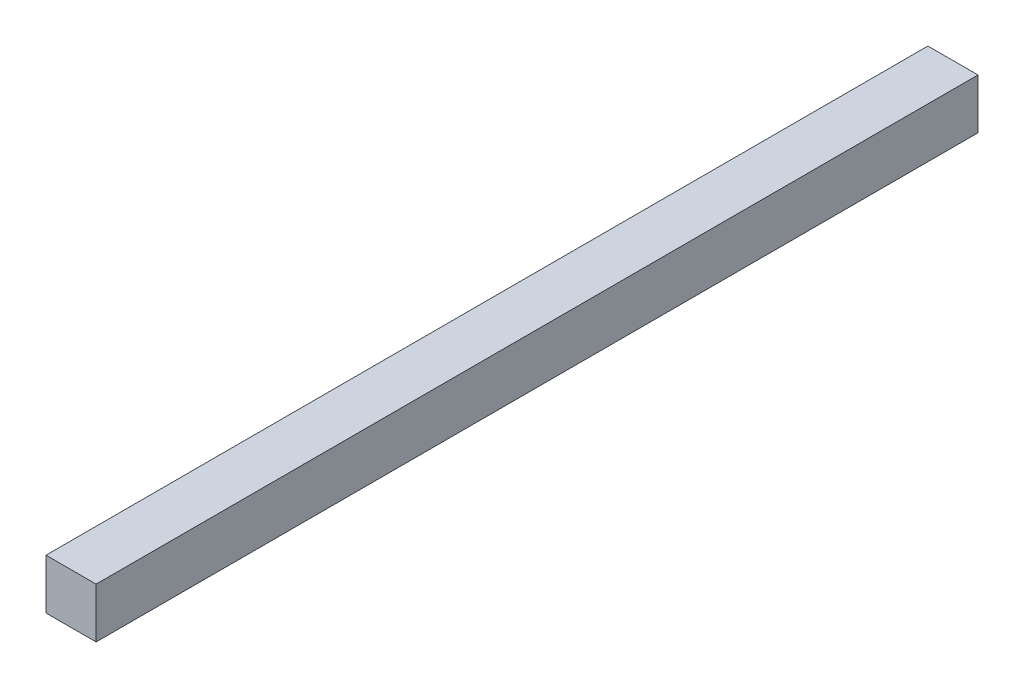
ISO-10303-21;
HEADER;
FILE_DESCRIPTION(('STEP AP214'),'2;1');
FILE_NAME('part.step','',(''),(''),'','','');
FILE_SCHEMA(('AUTOMOTIVE_DESIGN { 1 0 10303 214 1 1 1 1 }'));
ENDSEC;
DATA;
#1=APPLICATION_CONTEXT('core data for automotive mechanical design processes');
#2=APPLICATION_PROTOCOL_DEFINITION('international standard','automotive_design',2000,#1);
#3=PRODUCT_CONTEXT('',#1,'mechanical');
#4=PRODUCT('Part','Part','',(#3));
#5=PRODUCT_RELATED_PRODUCT_CATEGORY('part','',(#4));
#6=PRODUCT_DEFINITION_FORMATION('','',#4);
#7=PRODUCT_DEFINITION_CONTEXT('part definition',#1,'design');
#8=PRODUCT_DEFINITION('design','',#6,#7);
#9=PRODUCT_DEFINITION_SHAPE('','',#8);
#10=(LENGTH_UNIT() NAMED_UNIT(*) SI_UNIT(.MILLI.,.METRE.));
#11=(NAMED_UNIT(*) PLANE_ANGLE_UNIT() SI_UNIT($,.RADIAN.));
#12=(NAMED_UNIT(*) SI_UNIT($,.STERADIAN.) SOLID_ANGLE_UNIT());
#13=UNCERTAINTY_MEASURE_WITH_UNIT(LENGTH_MEASURE(1.E-05),#10,'distance_accuracy_value','');
#14=(GEOMETRIC_REPRESENTATION_CONTEXT(3) GLOBAL_UNCERTAINTY_ASSIGNED_CONTEXT((#13)) GLOBAL_UNIT_ASSIGNED_CONTEXT((#10,
#11,#12)) REPRESENTATION_CONTEXT('',''));
#15=CARTESIAN_POINT('',(0.,0.,0.));
#16=DIRECTION('',(0.,0.,1.));
#17=DIRECTION('',(1.,0.,0.));
#18=AXIS2_PLACEMENT_3D('',#15,#16,#17);
#19=CARTESIAN_POINT('',(0.,0.,8.8));
#20=DIRECTION('',(-1.,0.,0.));
#21=DIRECTION('',(0.,-1.,0.));
#22=AXIS2_PLACEMENT_3D('',#19,#20,#21);
#23=PLANE('',#22);
#24=DIRECTION('',(0.,1.,0.));
#25=VECTOR('',#24,1.);
#26=CARTESIAN_POINT('',(0.,0.,0.));
#27=LINE('',#26,#25);
#28=CARTESIAN_POINT('',(0.,0.,0.));
#29=VERTEX_POINT('',#28);
#30=CARTESIAN_POINT('',(0.,0.5,0.));
#31=VERTEX_POINT('',#30);
#32=EDGE_CURVE('E96',#29,#31,#27,.T.);
#33=ORIENTED_EDGE('',*,*,#32,.T.);
#34=DIRECTION('',(0.,0.,-1.));
#35=VECTOR('',#34,1.);
#36=CARTESIAN_POINT('',(0.,0.5,8.8));
#37=LINE('',#36,#35);
#38=CARTESIAN_POINT('',(0.,0.5,8.8));
#39=VERTEX_POINT('',#38);
#40=EDGE_CURVE('E11',#39,#31,#37,.T.);
#41=ORIENTED_EDGE('',*,*,#40,.F.);
#42=DIRECTION('',(0.,1.,0.));
#43=VECTOR('',#42,1.);
#44=CARTESIAN_POINT('',(0.,0.,8.8));
#45=LINE('',#44,#43);
#46=CARTESIAN_POINT('',(0.,0.,8.8));
#47=VERTEX_POINT('',#46);
#48=EDGE_CURVE('E84',#47,#39,#45,.T.);
#49=ORIENTED_EDGE('',*,*,#48,.F.);
#50=DIRECTION('',(0.,0.,-1.));
#51=VECTOR('',#50,1.);
#52=CARTESIAN_POINT('',(0.,0.,8.8));
#53=LINE('',#52,#51);
#54=EDGE_CURVE('E92',#47,#29,#53,.T.);
#55=ORIENTED_EDGE('',*,*,#54,.T.);
#56=EDGE_LOOP('',(#33,#41,#49,#55));
#57=FACE_BOUND('',#56,.T.);
#58=ADVANCED_FACE('F33',(#57),#23,.F.);
#59=CARTESIAN_POINT('',(0.,0.5,8.8));
#60=DIRECTION('',(0.,-1.,0.));
#61=DIRECTION('',(1.,0.,0.));
#62=AXIS2_PLACEMENT_3D('',#59,#60,#61);
#63=PLANE('',#62);
#64=DIRECTION('',(-1.,0.,0.));
#65=VECTOR('',#64,1.);
#66=CARTESIAN_POINT('',(0.,0.5,0.));
#67=LINE('',#66,#65);
#68=CARTESIAN_POINT('',(-0.5,0.5,0.));
#69=VERTEX_POINT('',#68);
#70=EDGE_CURVE('E88',#31,#69,#67,.T.);
#71=ORIENTED_EDGE('',*,*,#70,.T.);
#72=DIRECTION('',(0.,0.,-1.));
#73=VECTOR('',#72,1.);
#74=CARTESIAN_POINT('',(-0.5,0.5,8.8));
#75=LINE('',#74,#73);
#76=CARTESIAN_POINT('',(-0.5,0.5,8.8));
#77=VERTEX_POINT('',#76);
#78=EDGE_CURVE('E41',#77,#69,#75,.T.);
#79=ORIENTED_EDGE('',*,*,#78,.F.);
#80=DIRECTION('',(-1.,0.,0.));
#81=VECTOR('',#80,1.);
#82=CARTESIAN_POINT('',(0.,0.5,8.8));
#83=LINE('',#82,#81);
#84=EDGE_CURVE('E79',#39,#77,#83,.T.);
#85=ORIENTED_EDGE('',*,*,#84,.F.);
#86=ORIENTED_EDGE('',*,*,#40,.T.);
#87=EDGE_LOOP('',(#71,#79,#85,#86));
#88=FACE_BOUND('',#87,.T.);
#89=ADVANCED_FACE('F87',(#88),#63,.F.);
#90=CARTESIAN_POINT('',(-0.5,0.,8.8));
#91=DIRECTION('',(1.,0.,0.));
#92=DIRECTION('',(0.,0.,-1.));
#93=AXIS2_PLACEMENT_3D('',#90,#91,#92);
#94=PLANE('',#93);
#95=DIRECTION('',(0.,-1.,0.));
#96=VECTOR('',#95,1.);
#97=CARTESIAN_POINT('',(-0.5,0.,0.));
#98=LINE('',#97,#96);
#99=CARTESIAN_POINT('',(-0.5,0.,0.));
#100=VERTEX_POINT('',#99);
#101=EDGE_CURVE('E66',#69,#100,#98,.T.);
#102=ORIENTED_EDGE('',*,*,#101,.T.);
#103=DIRECTION('',(0.,0.,-1.));
#104=VECTOR('',#103,1.);
#105=CARTESIAN_POINT('',(-0.5,0.,8.8));
#106=LINE('',#105,#104);
#107=CARTESIAN_POINT('',(-0.5,0.,8.8));
#108=VERTEX_POINT('',#107);
#109=EDGE_CURVE('E89',#108,#100,#106,.T.);
#110=ORIENTED_EDGE('',*,*,#109,.F.);
#111=DIRECTION('',(0.,-1.,0.));
#112=VECTOR('',#111,1.);
#113=CARTESIAN_POINT('',(-0.5,0.,8.8));
#114=LINE('',#113,#112);
#115=EDGE_CURVE('E82',#77,#108,#114,.T.);
#116=ORIENTED_EDGE('',*,*,#115,.F.);
#117=ORIENTED_EDGE('',*,*,#78,.T.);
#118=EDGE_LOOP('',(#102,#110,#116,#117));
#119=FACE_BOUND('',#118,.T.);
#120=ADVANCED_FACE('F90',(#119),#94,.F.);
#121=CARTESIAN_POINT('',(0.,0.,8.8));
#122=DIRECTION('',(0.,1.,0.));
#123=DIRECTION('',(0.,0.,1.));
#124=AXIS2_PLACEMENT_3D('',#121,#122,#123);
#125=PLANE('',#124);
#126=DIRECTION('',(1.,0.,0.));
#127=VECTOR('',#126,1.);
#128=CARTESIAN_POINT('',(0.,0.,0.));
#129=LINE('',#128,#127);
#130=EDGE_CURVE('E72',#100,#29,#129,.T.);
#131=ORIENTED_EDGE('',*,*,#130,.T.);
#132=ORIENTED_EDGE('',*,*,#54,.F.);
#133=DIRECTION('',(1.,0.,0.));
#134=VECTOR('',#133,1.);
#135=CARTESIAN_POINT('',(0.,0.,8.8));
#136=LINE('',#135,#134);
#137=EDGE_CURVE('E49',#108,#47,#136,.T.);
#138=ORIENTED_EDGE('',*,*,#137,.F.);
#139=ORIENTED_EDGE('',*,*,#109,.T.);
#140=EDGE_LOOP('',(#131,#132,#138,#139));
#141=FACE_BOUND('',#140,.T.);
#142=ADVANCED_FACE('F103',(#141),#125,.F.);
#143=CARTESIAN_POINT('',(0.,0.,8.8));
#144=DIRECTION('',(0.,0.,1.));
#145=DIRECTION('',(1.,0.,0.));
#146=AXIS2_PLACEMENT_3D('',#143,#144,#145);
#147=PLANE('',#146);
#148=ORIENTED_EDGE('',*,*,#48,.T.);
#149=ORIENTED_EDGE('',*,*,#84,.T.);
#150=ORIENTED_EDGE('',*,*,#115,.T.);
#151=ORIENTED_EDGE('',*,*,#137,.T.);
#152=EDGE_LOOP('',(#148,#149,#150,#151));
#153=FACE_BOUND('',#152,.T.);
#154=ADVANCED_FACE('F80',(#153),#147,.T.);
#155=CARTESIAN_POINT('',(0.,0.,0.));
#156=DIRECTION('',(0.,0.,1.));
#157=DIRECTION('',(1.,0.,0.));
#158=AXIS2_PLACEMENT_3D('',#155,#156,#157);
#159=PLANE('',#158);
#160=ORIENTED_EDGE('',*,*,#32,.F.);
#161=ORIENTED_EDGE('',*,*,#130,.F.);
#162=ORIENTED_EDGE('',*,*,#101,.F.);
#163=ORIENTED_EDGE('',*,*,#70,.F.);
#164=EDGE_LOOP('',(#160,#161,#162,#163));
#165=FACE_BOUND('',#164,.T.);
#166=ADVANCED_FACE('F106',(#165),#159,.F.);
#167=CLOSED_SHELL('',(#58,#89,#120,#142,#154,#166));
#168=MANIFOLD_SOLID_BREP('B2',#167);
#169=ADVANCED_BREP_SHAPE_REPRESENTATION('',(#18,#168),#14);
#170=SHAPE_DEFINITION_REPRESENTATION(#9,#169);
ENDSEC;
END-ISO-10303-21;
